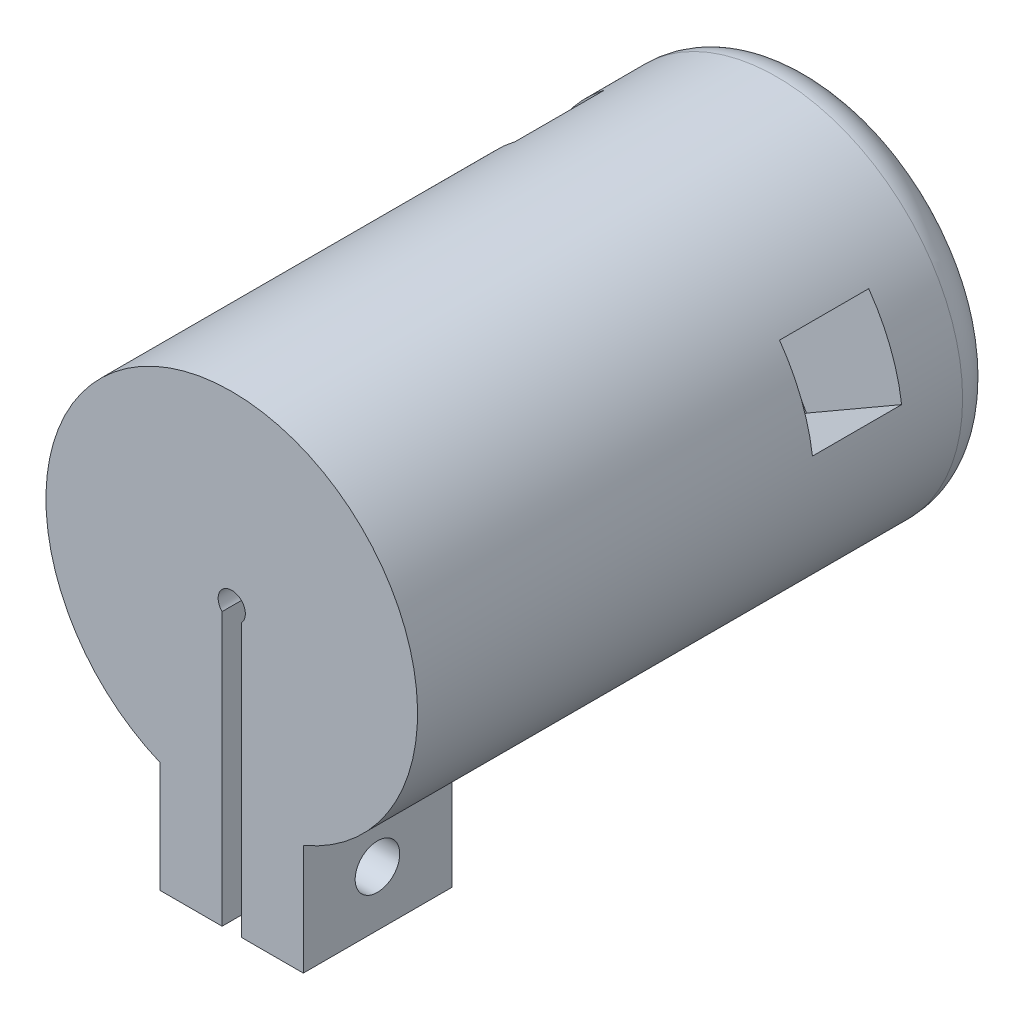
ISO-10303-21;
HEADER;
FILE_DESCRIPTION(('STEP AP214'),'2;1');
FILE_NAME('part.step','',(''),(''),'','','');
FILE_SCHEMA(('AUTOMOTIVE_DESIGN { 1 0 10303 214 1 1 1 1 }'));
ENDSEC;
DATA;
#1=APPLICATION_CONTEXT('core data for automotive mechanical design processes');
#2=APPLICATION_PROTOCOL_DEFINITION('international standard','automotive_design',2000,#1);
#3=PRODUCT_CONTEXT('',#1,'mechanical');
#4=PRODUCT('Part','Part','',(#3));
#5=PRODUCT_RELATED_PRODUCT_CATEGORY('part','',(#4));
#6=PRODUCT_DEFINITION_FORMATION('','',#4);
#7=PRODUCT_DEFINITION_CONTEXT('part definition',#1,'design');
#8=PRODUCT_DEFINITION('design','',#6,#7);
#9=PRODUCT_DEFINITION_SHAPE('','',#8);
#10=(LENGTH_UNIT() NAMED_UNIT(*) SI_UNIT(.MILLI.,.METRE.));
#11=(NAMED_UNIT(*) PLANE_ANGLE_UNIT() SI_UNIT($,.RADIAN.));
#12=(NAMED_UNIT(*) SI_UNIT($,.STERADIAN.) SOLID_ANGLE_UNIT());
#13=UNCERTAINTY_MEASURE_WITH_UNIT(LENGTH_MEASURE(1.E-05),#10,'distance_accuracy_value','');
#14=(GEOMETRIC_REPRESENTATION_CONTEXT(3) GLOBAL_UNCERTAINTY_ASSIGNED_CONTEXT((#13)) GLOBAL_UNIT_ASSIGNED_CONTEXT((#10,
#11,#12)) REPRESENTATION_CONTEXT('',''));
#15=CARTESIAN_POINT('',(0.,0.,0.));
#16=DIRECTION('',(0.,0.,1.));
#17=DIRECTION('',(1.,0.,0.));
#18=AXIS2_PLACEMENT_3D('',#15,#16,#17);
#19=CARTESIAN_POINT('',(0.,0.,-32.));
#20=DIRECTION('',(0.,0.,1.));
#21=DIRECTION('',(1.,0.,0.));
#22=AXIS2_PLACEMENT_3D('',#19,#20,#21);
#23=TOROIDAL_SURFACE('',#22,12.,3.);
#24=CARTESIAN_POINT('',(0.,0.,-35.));
#25=DIRECTION('',(0.,0.,1.));
#26=DIRECTION('',(1.,0.,0.));
#27=AXIS2_PLACEMENT_3D('',#24,#25,#26);
#28=CIRCLE('',#27,12.);
#29=CARTESIAN_POINT('',(12.,0.,-35.));
#30=VERTEX_POINT('',#29);
#31=EDGE_CURVE('E45',#30,#30,#28,.F.);
#32=ORIENTED_EDGE('',*,*,#31,.F.);
#33=EDGE_LOOP('',(#32));
#34=FACE_BOUND('',#33,.T.);
#35=CARTESIAN_POINT('',(0.,0.,-32.));
#36=DIRECTION('',(0.,0.,1.));
#37=DIRECTION('',(1.,0.,0.));
#38=AXIS2_PLACEMENT_3D('',#35,#36,#37);
#39=CIRCLE('',#38,15.);
#40=CARTESIAN_POINT('',(15.,0.,-32.));
#41=VERTEX_POINT('',#40);
#42=EDGE_CURVE('E11',#41,#41,#39,.T.);
#43=ORIENTED_EDGE('',*,*,#42,.F.);
#44=EDGE_LOOP('',(#43));
#45=FACE_BOUND('',#44,.T.);
#46=ADVANCED_FACE('F37',(#34,#45),#23,.T.);
#47=CARTESIAN_POINT('',(0.,0.,12.));
#48=DIRECTION('',(0.,0.,-1.));
#49=DIRECTION('',(-1.,0.,0.));
#50=AXIS2_PLACEMENT_3D('',#47,#48,#49);
#51=CYLINDRICAL_SURFACE('',#50,15.);
#52=ORIENTED_EDGE('',*,*,#42,.T.);
#53=EDGE_LOOP('',(#52));
#54=FACE_BOUND('',#53,.T.);
#55=CARTESIAN_POINT('',(0.,0.,-27.2));
#56=DIRECTION('',(0.,0.,1.));
#57=DIRECTION('',(1.,0.,0.));
#58=AXIS2_PLACEMENT_3D('',#55,#56,#57);
#59=CIRCLE('',#58,15.);
#60=CARTESIAN_POINT('',(14.8769285434171,1.91754976833983,-27.2));
#61=VERTEX_POINT('',#60);
#62=CARTESIAN_POINT('',(12.2207704523787,8.69786005579919,-27.2));
#63=VERTEX_POINT('',#62);
#64=EDGE_CURVE('E339',#61,#63,#59,.T.);
#65=ORIENTED_EDGE('',*,*,#64,.F.);
#66=DIRECTION('',(0.,0.,-1.));
#67=VECTOR('',#66,1.);
#68=CARTESIAN_POINT('',(14.8769285434171,1.91754976833982,12.));
#69=LINE('',#68,#67);
#70=CARTESIAN_POINT('',(14.8769285434171,1.91754976833982,-20.));
#71=VERTEX_POINT('',#70);
#72=EDGE_CURVE('E331',#61,#71,#69,.F.);
#73=ORIENTED_EDGE('',*,*,#72,.T.);
#74=CARTESIAN_POINT('',(0.,0.,-20.));
#75=DIRECTION('',(0.,0.,1.));
#76=DIRECTION('',(0.,-1.,0.));
#77=AXIS2_PLACEMENT_3D('',#74,#75,#76);
#78=CIRCLE('',#77,15.);
#79=CARTESIAN_POINT('',(12.2207704523787,8.69786005579919,-20.));
#80=VERTEX_POINT('',#79);
#81=EDGE_CURVE('E334',#71,#80,#78,.T.);
#82=ORIENTED_EDGE('',*,*,#81,.T.);
#83=DIRECTION('',(0.,0.,-1.));
#84=VECTOR('',#83,1.);
#85=CARTESIAN_POINT('',(12.2207704523787,8.69786005579919,12.));
#86=LINE('',#85,#84);
#87=EDGE_CURVE('E337',#63,#80,#86,.F.);
#88=ORIENTED_EDGE('',*,*,#87,.F.);
#89=EDGE_LOOP('',(#65,#73,#82,#88));
#90=FACE_BOUND('',#89,.T.);
#91=DIRECTION('',(0.,0.,-1.));
#92=VECTOR('',#91,1.);
#93=CARTESIAN_POINT('',(5.7778174593052,-13.842572933055,12.));
#94=LINE('',#93,#92);
#95=CARTESIAN_POINT('',(5.7778174593052,-13.842572933055,12.));
#96=VERTEX_POINT('',#95);
#97=CARTESIAN_POINT('',(5.7778174593052,-13.842572933055,0.));
#98=VERTEX_POINT('',#97);
#99=EDGE_CURVE('E309',#96,#98,#94,.T.);
#100=ORIENTED_EDGE('',*,*,#99,.T.);
#101=CARTESIAN_POINT('',(0.,0.,0.));
#102=DIRECTION('',(0.,0.,1.));
#103=DIRECTION('',(1.,0.,0.));
#104=AXIS2_PLACEMENT_3D('',#101,#102,#103);
#105=CIRCLE('',#104,15.);
#106=CARTESIAN_POINT('',(0.7778174593052,-14.9798197585952,0.));
#107=VERTEX_POINT('',#106);
#108=EDGE_CURVE('E258',#107,#98,#105,.T.);
#109=ORIENTED_EDGE('',*,*,#108,.F.);
#110=CARTESIAN_POINT('',(-0.777817459305205,-14.9798197585952,0.));
#111=VERTEX_POINT('',#110);
#112=EDGE_CURVE('E253',#111,#107,#105,.T.);
#113=ORIENTED_EDGE('',*,*,#112,.F.);
#114=CARTESIAN_POINT('',(-5.7778174593052,-13.842572933055,0.));
#115=VERTEX_POINT('',#114);
#116=EDGE_CURVE('E254',#115,#111,#105,.T.);
#117=ORIENTED_EDGE('',*,*,#116,.F.);
#118=DIRECTION('',(0.,0.,-1.));
#119=VECTOR('',#118,1.);
#120=CARTESIAN_POINT('',(-5.7778174593052,-13.842572933055,12.));
#121=LINE('',#120,#119);
#122=CARTESIAN_POINT('',(-5.7778174593052,-13.842572933055,12.));
#123=VERTEX_POINT('',#122);
#124=EDGE_CURVE('E306',#123,#115,#121,.T.);
#125=ORIENTED_EDGE('',*,*,#124,.F.);
#126=CARTESIAN_POINT('',(0.,0.,12.));
#127=DIRECTION('',(0.,0.,1.));
#128=DIRECTION('',(1.,0.,0.));
#129=AXIS2_PLACEMENT_3D('',#126,#127,#128);
#130=CIRCLE('',#129,15.);
#131=EDGE_CURVE('E269',#96,#123,#130,.T.);
#132=ORIENTED_EDGE('',*,*,#131,.F.);
#133=EDGE_LOOP('',(#100,#109,#113,#117,#125,#132));
#134=FACE_BOUND('',#133,.T.);
#135=CARTESIAN_POINT('',(0.,0.,-27.2));
#136=DIRECTION('',(0.,0.,1.));
#137=DIRECTION('',(1.,0.,0.));
#138=AXIS2_PLACEMENT_3D('',#135,#136,#137);
#139=CIRCLE('',#138,15.);
#140=CARTESIAN_POINT('',(-5.77781745930519,-13.842572933055,-27.2));
#141=VERTEX_POINT('',#140);
#142=CARTESIAN_POINT('',(1.42218254069481,-14.9324276934778,-27.2));
#143=VERTEX_POINT('',#142);
#144=EDGE_CURVE('E329',#141,#143,#139,.T.);
#145=ORIENTED_EDGE('',*,*,#144,.F.);
#146=DIRECTION('',(0.,0.,-1.));
#147=VECTOR('',#146,1.);
#148=CARTESIAN_POINT('',(-5.77781745930519,-13.842572933055,12.));
#149=LINE('',#148,#147);
#150=CARTESIAN_POINT('',(-5.77781745930519,-13.842572933055,-20.));
#151=VERTEX_POINT('',#150);
#152=EDGE_CURVE('E321',#141,#151,#149,.F.);
#153=ORIENTED_EDGE('',*,*,#152,.T.);
#154=CARTESIAN_POINT('',(0.,0.,-20.));
#155=DIRECTION('',(0.,0.,1.));
#156=DIRECTION('',(1.,0.,0.));
#157=AXIS2_PLACEMENT_3D('',#154,#155,#156);
#158=CIRCLE('',#157,15.);
#159=CARTESIAN_POINT('',(1.42218254069481,-14.9324276934778,-20.));
#160=VERTEX_POINT('',#159);
#161=EDGE_CURVE('E324',#151,#160,#158,.T.);
#162=ORIENTED_EDGE('',*,*,#161,.T.);
#163=DIRECTION('',(0.,0.,-1.));
#164=VECTOR('',#163,1.);
#165=CARTESIAN_POINT('',(1.42218254069481,-14.9324276934778,12.));
#166=LINE('',#165,#164);
#167=EDGE_CURVE('E327',#143,#160,#166,.F.);
#168=ORIENTED_EDGE('',*,*,#167,.F.);
#169=EDGE_LOOP('',(#145,#153,#162,#168));
#170=FACE_BOUND('',#169,.T.);
#171=CARTESIAN_POINT('',(0.,0.,-27.2));
#172=DIRECTION('',(0.,0.,1.));
#173=DIRECTION('',(1.,0.,0.));
#174=AXIS2_PLACEMENT_3D('',#171,#172,#173);
#175=CIRCLE('',#174,15.);
#176=CARTESIAN_POINT('',(-9.09911108411189,11.9250231647151,-27.2));
#177=VERTEX_POINT('',#176);
#178=CARTESIAN_POINT('',(-13.6429529930734,6.23456763767856,-27.2));
#179=VERTEX_POINT('',#178);
#180=EDGE_CURVE('E187',#177,#179,#175,.T.);
#181=ORIENTED_EDGE('',*,*,#180,.F.);
#182=DIRECTION('',(0.,0.,-1.));
#183=VECTOR('',#182,1.);
#184=CARTESIAN_POINT('',(-9.09911108411188,11.9250231647151,12.));
#185=LINE('',#184,#183);
#186=CARTESIAN_POINT('',(-9.09911108411188,11.9250231647151,-20.));
#187=VERTEX_POINT('',#186);
#188=EDGE_CURVE('E341',#177,#187,#185,.F.);
#189=ORIENTED_EDGE('',*,*,#188,.T.);
#190=CARTESIAN_POINT('',(0.,0.,-20.));
#191=DIRECTION('',(0.,0.,1.));
#192=DIRECTION('',(0.,-1.,0.));
#193=AXIS2_PLACEMENT_3D('',#190,#191,#192);
#194=CIRCLE('',#193,15.);
#195=CARTESIAN_POINT('',(-13.6429529930734,6.23456763767856,-20.));
#196=VERTEX_POINT('',#195);
#197=EDGE_CURVE('E344',#187,#196,#194,.T.);
#198=ORIENTED_EDGE('',*,*,#197,.T.);
#199=DIRECTION('',(0.,0.,-1.));
#200=VECTOR('',#199,1.);
#201=CARTESIAN_POINT('',(-13.6429529930734,6.23456763767857,12.));
#202=LINE('',#201,#200);
#203=EDGE_CURVE('E347',#179,#196,#202,.F.);
#204=ORIENTED_EDGE('',*,*,#203,.F.);
#205=EDGE_LOOP('',(#181,#189,#198,#204));
#206=FACE_BOUND('',#205,.T.);
#207=ADVANCED_FACE('F357',(#54,#90,#134,#170,#206),#51,.T.);
#208=CARTESIAN_POINT('',(0.,0.,0.));
#209=DIRECTION('',(0.,0.,1.));
#210=DIRECTION('',(1.,0.,0.));
#211=AXIS2_PLACEMENT_3D('',#208,#209,#210);
#212=PLANE('',#211);
#213=DIRECTION('',(0.,1.,0.));
#214=VECTOR('',#213,1.);
#215=CARTESIAN_POINT('',(-5.7778174593052,0.,0.));
#216=LINE('',#215,#214);
#217=CARTESIAN_POINT('',(-5.7778174593052,-22.7778174593052,0.));
#218=VERTEX_POINT('',#217);
#219=EDGE_CURVE('E291',#218,#115,#216,.T.);
#220=ORIENTED_EDGE('',*,*,#219,.T.);
#221=ORIENTED_EDGE('',*,*,#116,.T.);
#222=DIRECTION('',(0.,-1.,0.));
#223=VECTOR('',#222,1.);
#224=CARTESIAN_POINT('',(-0.777817459305206,0.,0.));
#225=LINE('',#224,#223);
#226=CARTESIAN_POINT('',(-0.777817459305204,-22.7778174593052,0.));
#227=VERTEX_POINT('',#226);
#228=EDGE_CURVE('E297',#111,#227,#225,.T.);
#229=ORIENTED_EDGE('',*,*,#228,.T.);
#230=DIRECTION('',(-1.,0.,0.));
#231=VECTOR('',#230,1.);
#232=CARTESIAN_POINT('',(0.,-22.7778174593052,0.));
#233=LINE('',#232,#231);
#234=EDGE_CURVE('E294',#227,#218,#233,.T.);
#235=ORIENTED_EDGE('',*,*,#234,.T.);
#236=EDGE_LOOP('',(#220,#221,#229,#235));
#237=FACE_BOUND('',#236,.T.);
#238=ADVANCED_FACE('F362',(#237),#212,.F.);
#239=CARTESIAN_POINT('',(0.,0.,12.));
#240=DIRECTION('',(0.,0.,-1.));
#241=DIRECTION('',(-1.,0.,0.));
#242=AXIS2_PLACEMENT_3D('',#239,#240,#241);
#243=CYLINDRICAL_SURFACE('',#242,1.1);
#244=CARTESIAN_POINT('',(0.,0.,0.));
#245=DIRECTION('',(0.,0.,1.));
#246=DIRECTION('',(1.,0.,0.));
#247=AXIS2_PLACEMENT_3D('',#244,#245,#246);
#248=CIRCLE('',#247,1.1);
#249=CARTESIAN_POINT('',(0.777817459305198,-0.777817459305206,0.));
#250=VERTEX_POINT('',#249);
#251=CARTESIAN_POINT('',(-0.777817459305206,-0.777817459305198,0.));
#252=VERTEX_POINT('',#251);
#253=EDGE_CURVE('E257',#250,#252,#248,.T.);
#254=ORIENTED_EDGE('',*,*,#253,.F.);
#255=DIRECTION('',(0.,0.,-1.));
#256=VECTOR('',#255,1.);
#257=CARTESIAN_POINT('',(0.777817459305198,-0.777817459305206,12.));
#258=LINE('',#257,#256);
#259=CARTESIAN_POINT('',(0.777817459305198,-0.777817459305206,12.));
#260=VERTEX_POINT('',#259);
#261=EDGE_CURVE('E318',#260,#250,#258,.T.);
#262=ORIENTED_EDGE('',*,*,#261,.F.);
#263=CARTESIAN_POINT('',(0.,0.,12.));
#264=DIRECTION('',(0.,0.,1.));
#265=DIRECTION('',(1.,0.,0.));
#266=AXIS2_PLACEMENT_3D('',#263,#264,#265);
#267=CIRCLE('',#266,1.1);
#268=CARTESIAN_POINT('',(-0.777817459305206,-0.777817459305198,12.));
#269=VERTEX_POINT('',#268);
#270=EDGE_CURVE('E259',#260,#269,#267,.T.);
#271=ORIENTED_EDGE('',*,*,#270,.T.);
#272=DIRECTION('',(0.,0.,-1.));
#273=VECTOR('',#272,1.);
#274=CARTESIAN_POINT('',(-0.777817459305206,-0.777817459305198,12.));
#275=LINE('',#274,#273);
#276=EDGE_CURVE('E280',#269,#252,#275,.T.);
#277=ORIENTED_EDGE('',*,*,#276,.T.);
#278=EDGE_LOOP('',(#254,#262,#271,#277));
#279=FACE_BOUND('',#278,.T.);
#280=ADVANCED_FACE('F466',(#279),#243,.F.);
#281=CARTESIAN_POINT('',(0.777817459305198,0.,12.));
#282=DIRECTION('',(1.,0.,0.));
#283=DIRECTION('',(0.,1.,0.));
#284=AXIS2_PLACEMENT_3D('',#281,#282,#283);
#285=PLANE('',#284);
#286=CARTESIAN_POINT('',(0.777817459305201,-18.3217496466459,6.01614639735323));
#287=DIRECTION('',(1.,0.,0.));
#288=DIRECTION('',(0.,1.,0.));
#289=AXIS2_PLACEMENT_3D('',#286,#287,#288);
#290=CIRCLE('',#289,1.8);
#291=CARTESIAN_POINT('',(0.777817459305201,-16.5217496466459,6.01614639735323));
#292=VERTEX_POINT('',#291);
#293=EDGE_CURVE('E704',#292,#292,#290,.T.);
#294=ORIENTED_EDGE('',*,*,#293,.T.);
#295=EDGE_LOOP('',(#294));
#296=FACE_BOUND('',#295,.T.);
#297=DIRECTION('',(0.,-1.,0.));
#298=VECTOR('',#297,1.);
#299=CARTESIAN_POINT('',(0.777817459305198,0.,0.));
#300=LINE('',#299,#298);
#301=EDGE_CURVE('E283',#250,#107,#300,.T.);
#302=ORIENTED_EDGE('',*,*,#301,.T.);
#303=CARTESIAN_POINT('',(0.777817459305201,-22.7778174593052,0.));
#304=VERTEX_POINT('',#303);
#305=EDGE_CURVE('E282',#107,#304,#300,.T.);
#306=ORIENTED_EDGE('',*,*,#305,.T.);
#307=DIRECTION('',(0.,0.,-1.));
#308=VECTOR('',#307,1.);
#309=CARTESIAN_POINT('',(0.777817459305201,-22.7778174593052,12.));
#310=LINE('',#309,#308);
#311=CARTESIAN_POINT('',(0.777817459305201,-22.7778174593052,12.));
#312=VERTEX_POINT('',#311);
#313=EDGE_CURVE('E315',#312,#304,#310,.T.);
#314=ORIENTED_EDGE('',*,*,#313,.F.);
#315=DIRECTION('',(0.,-1.,0.));
#316=VECTOR('',#315,1.);
#317=CARTESIAN_POINT('',(0.777817459305198,0.,12.));
#318=LINE('',#317,#316);
#319=EDGE_CURVE('E262',#260,#312,#318,.T.);
#320=ORIENTED_EDGE('',*,*,#319,.F.);
#321=ORIENTED_EDGE('',*,*,#261,.T.);
#322=EDGE_LOOP('',(#302,#306,#314,#320,#321));
#323=FACE_BOUND('',#322,.T.);
#324=ADVANCED_FACE('F463',(#296,#323),#285,.F.);
#325=CARTESIAN_POINT('',(0.,-22.7778174593052,12.));
#326=DIRECTION('',(0.,1.,0.));
#327=DIRECTION('',(0.,0.,1.));
#328=AXIS2_PLACEMENT_3D('',#325,#326,#327);
#329=PLANE('',#328);
#330=DIRECTION('',(1.,0.,0.));
#331=VECTOR('',#330,1.);
#332=CARTESIAN_POINT('',(0.,-22.7778174593052,0.));
#333=LINE('',#332,#331);
#334=CARTESIAN_POINT('',(5.7778174593052,-22.7778174593052,0.));
#335=VERTEX_POINT('',#334);
#336=EDGE_CURVE('E286',#304,#335,#333,.T.);
#337=ORIENTED_EDGE('',*,*,#336,.T.);
#338=DIRECTION('',(0.,0.,-1.));
#339=VECTOR('',#338,1.);
#340=CARTESIAN_POINT('',(5.7778174593052,-22.7778174593052,12.));
#341=LINE('',#340,#339);
#342=CARTESIAN_POINT('',(5.7778174593052,-22.7778174593052,12.));
#343=VERTEX_POINT('',#342);
#344=EDGE_CURVE('E312',#343,#335,#341,.T.);
#345=ORIENTED_EDGE('',*,*,#344,.F.);
#346=DIRECTION('',(1.,0.,0.));
#347=VECTOR('',#346,1.);
#348=CARTESIAN_POINT('',(0.,-22.7778174593052,12.));
#349=LINE('',#348,#347);
#350=EDGE_CURVE('E265',#312,#343,#349,.T.);
#351=ORIENTED_EDGE('',*,*,#350,.F.);
#352=ORIENTED_EDGE('',*,*,#313,.T.);
#353=EDGE_LOOP('',(#337,#345,#351,#352));
#354=FACE_BOUND('',#353,.T.);
#355=ADVANCED_FACE('F459',(#354),#329,.F.);
#356=CARTESIAN_POINT('',(5.77781745930521,0.,12.));
#357=DIRECTION('',(-1.,0.,0.));
#358=DIRECTION('',(0.,-1.,0.));
#359=AXIS2_PLACEMENT_3D('',#356,#357,#358);
#360=PLANE('',#359);
#361=CARTESIAN_POINT('',(5.7778174593052,-18.3217496466459,6.01614639735323));
#362=DIRECTION('',(-1.,0.,0.));
#363=DIRECTION('',(0.,-1.,0.));
#364=AXIS2_PLACEMENT_3D('',#361,#362,#363);
#365=CIRCLE('',#364,1.8);
#366=CARTESIAN_POINT('',(5.7778174593052,-20.1217496466459,6.01614639735323));
#367=VERTEX_POINT('',#366);
#368=EDGE_CURVE('E210',#367,#367,#365,.T.);
#369=ORIENTED_EDGE('',*,*,#368,.T.);
#370=EDGE_LOOP('',(#369));
#371=FACE_BOUND('',#370,.T.);
#372=DIRECTION('',(0.,1.,0.));
#373=VECTOR('',#372,1.);
#374=CARTESIAN_POINT('',(5.77781745930521,0.,0.));
#375=LINE('',#374,#373);
#376=EDGE_CURVE('E288',#335,#98,#375,.T.);
#377=ORIENTED_EDGE('',*,*,#376,.T.);
#378=ORIENTED_EDGE('',*,*,#99,.F.);
#379=DIRECTION('',(0.,1.,0.));
#380=VECTOR('',#379,1.);
#381=CARTESIAN_POINT('',(5.77781745930521,0.,12.));
#382=LINE('',#381,#380);
#383=EDGE_CURVE('E267',#343,#96,#382,.T.);
#384=ORIENTED_EDGE('',*,*,#383,.F.);
#385=ORIENTED_EDGE('',*,*,#344,.T.);
#386=EDGE_LOOP('',(#377,#378,#384,#385));
#387=FACE_BOUND('',#386,.T.);
#388=ADVANCED_FACE('F454',(#371,#387),#360,.F.);
#389=CARTESIAN_POINT('',(-5.7778174593052,0.,12.));
#390=DIRECTION('',(-1.,0.,0.));
#391=DIRECTION('',(0.,-1.,0.));
#392=AXIS2_PLACEMENT_3D('',#389,#390,#391);
#393=PLANE('',#392);
#394=CARTESIAN_POINT('',(-5.7778174593052,-18.3217496466459,6.01614639735323));
#395=DIRECTION('',(-1.,0.,0.));
#396=DIRECTION('',(0.,0.,1.));
#397=AXIS2_PLACEMENT_3D('',#394,#395,#396);
#398=CIRCLE('',#397,3.15);
#399=CARTESIAN_POINT('',(-5.7778174593052,-18.3217496466459,9.16614639735323));
#400=VERTEX_POINT('',#399);
#401=EDGE_CURVE('E712',#400,#400,#398,.T.);
#402=ORIENTED_EDGE('',*,*,#401,.F.);
#403=EDGE_LOOP('',(#402));
#404=FACE_BOUND('',#403,.T.);
#405=ORIENTED_EDGE('',*,*,#219,.F.);
#406=DIRECTION('',(0.,0.,-1.));
#407=VECTOR('',#406,1.);
#408=CARTESIAN_POINT('',(-5.7778174593052,-22.7778174593052,12.));
#409=LINE('',#408,#407);
#410=CARTESIAN_POINT('',(-5.7778174593052,-22.7778174593052,12.));
#411=VERTEX_POINT('',#410);
#412=EDGE_CURVE('E304',#411,#218,#409,.T.);
#413=ORIENTED_EDGE('',*,*,#412,.F.);
#414=DIRECTION('',(0.,1.,0.));
#415=VECTOR('',#414,1.);
#416=CARTESIAN_POINT('',(-5.7778174593052,0.,12.));
#417=LINE('',#416,#415);
#418=EDGE_CURVE('E271',#411,#123,#417,.T.);
#419=ORIENTED_EDGE('',*,*,#418,.T.);
#420=ORIENTED_EDGE('',*,*,#124,.T.);
#421=EDGE_LOOP('',(#405,#413,#419,#420));
#422=FACE_BOUND('',#421,.T.);
#423=ADVANCED_FACE('F451',(#404,#422),#393,.T.);
#424=CARTESIAN_POINT('',(0.,-22.7778174593052,12.));
#425=DIRECTION('',(0.,-1.,0.));
#426=DIRECTION('',(0.,0.,-1.));
#427=AXIS2_PLACEMENT_3D('',#424,#425,#426);
#428=PLANE('',#427);
#429=ORIENTED_EDGE('',*,*,#234,.F.);
#430=DIRECTION('',(0.,0.,-1.));
#431=VECTOR('',#430,1.);
#432=CARTESIAN_POINT('',(-0.777817459305204,-22.7778174593052,12.));
#433=LINE('',#432,#431);
#434=CARTESIAN_POINT('',(-0.777817459305204,-22.7778174593052,12.));
#435=VERTEX_POINT('',#434);
#436=EDGE_CURVE('E301',#435,#227,#433,.T.);
#437=ORIENTED_EDGE('',*,*,#436,.F.);
#438=DIRECTION('',(-1.,0.,0.));
#439=VECTOR('',#438,1.);
#440=CARTESIAN_POINT('',(0.,-22.7778174593052,12.));
#441=LINE('',#440,#439);
#442=EDGE_CURVE('E274',#435,#411,#441,.T.);
#443=ORIENTED_EDGE('',*,*,#442,.T.);
#444=ORIENTED_EDGE('',*,*,#412,.T.);
#445=EDGE_LOOP('',(#429,#437,#443,#444));
#446=FACE_BOUND('',#445,.T.);
#447=ADVANCED_FACE('F447',(#446),#428,.T.);
#448=CARTESIAN_POINT('',(-0.777817459305206,0.,12.));
#449=DIRECTION('',(1.,0.,0.));
#450=DIRECTION('',(0.,1.,0.));
#451=AXIS2_PLACEMENT_3D('',#448,#449,#450);
#452=PLANE('',#451);
#453=CARTESIAN_POINT('',(-0.777817459305205,-18.3217496466459,6.01614639735323));
#454=DIRECTION('',(1.,0.,0.));
#455=DIRECTION('',(0.,1.,0.));
#456=AXIS2_PLACEMENT_3D('',#453,#454,#455);
#457=CIRCLE('',#456,1.8);
#458=CARTESIAN_POINT('',(-0.777817459305205,-16.5217496466459,6.01614639735323));
#459=VERTEX_POINT('',#458);
#460=EDGE_CURVE('E40',#459,#459,#457,.T.);
#461=ORIENTED_EDGE('',*,*,#460,.F.);
#462=EDGE_LOOP('',(#461));
#463=FACE_BOUND('',#462,.T.);
#464=EDGE_CURVE('E263',#252,#111,#225,.T.);
#465=ORIENTED_EDGE('',*,*,#464,.F.);
#466=ORIENTED_EDGE('',*,*,#276,.F.);
#467=DIRECTION('',(0.,-1.,0.));
#468=VECTOR('',#467,1.);
#469=CARTESIAN_POINT('',(-0.777817459305206,0.,12.));
#470=LINE('',#469,#468);
#471=EDGE_CURVE('E277',#269,#435,#470,.T.);
#472=ORIENTED_EDGE('',*,*,#471,.T.);
#473=ORIENTED_EDGE('',*,*,#436,.T.);
#474=ORIENTED_EDGE('',*,*,#228,.F.);
#475=EDGE_LOOP('',(#465,#466,#472,#473,#474));
#476=FACE_BOUND('',#475,.T.);
#477=ADVANCED_FACE('F440',(#463,#476),#452,.T.);
#478=CARTESIAN_POINT('',(0.,0.,12.));
#479=DIRECTION('',(0.,0.,1.));
#480=DIRECTION('',(1.,0.,0.));
#481=AXIS2_PLACEMENT_3D('',#478,#479,#480);
#482=PLANE('',#481);
#483=ORIENTED_EDGE('',*,*,#270,.F.);
#484=ORIENTED_EDGE('',*,*,#319,.T.);
#485=ORIENTED_EDGE('',*,*,#350,.T.);
#486=ORIENTED_EDGE('',*,*,#383,.T.);
#487=ORIENTED_EDGE('',*,*,#131,.T.);
#488=ORIENTED_EDGE('',*,*,#418,.F.);
#489=ORIENTED_EDGE('',*,*,#442,.F.);
#490=ORIENTED_EDGE('',*,*,#471,.F.);
#491=EDGE_LOOP('',(#483,#484,#485,#486,#487,#488,#489,#490));
#492=FACE_BOUND('',#491,.T.);
#493=ADVANCED_FACE('F437',(#492),#482,.T.);
#494=ORIENTED_EDGE('',*,*,#305,.F.);
#495=ORIENTED_EDGE('',*,*,#108,.T.);
#496=ORIENTED_EDGE('',*,*,#376,.F.);
#497=ORIENTED_EDGE('',*,*,#336,.F.);
#498=EDGE_LOOP('',(#494,#495,#496,#497));
#499=FACE_BOUND('',#498,.T.);
#500=ADVANCED_FACE('F433',(#499),#212,.F.);
#501=CARTESIAN_POINT('',(0.,0.,-35.));
#502=DIRECTION('',(0.,0.,1.));
#503=DIRECTION('',(1.,0.,0.));
#504=AXIS2_PLACEMENT_3D('',#501,#502,#503);
#505=PLANE('',#504);
#506=ORIENTED_EDGE('',*,*,#31,.T.);
#507=EDGE_LOOP('',(#506));
#508=FACE_BOUND('',#507,.T.);
#509=ADVANCED_FACE('F353',(#508),#505,.F.);
#510=CARTESIAN_POINT('',(0.,0.,0.));
#511=DIRECTION('',(0.,0.,1.));
#512=DIRECTION('',(1.,0.,0.));
#513=AXIS2_PLACEMENT_3D('',#510,#511,#512);
#514=PLANE('',#513);
#515=ORIENTED_EDGE('',*,*,#253,.T.);
#516=ORIENTED_EDGE('',*,*,#464,.T.);
#517=ORIENTED_EDGE('',*,*,#112,.T.);
#518=ORIENTED_EDGE('',*,*,#301,.F.);
#519=EDGE_LOOP('',(#515,#516,#517,#518));
#520=FACE_BOUND('',#519,.T.);
#521=ADVANCED_FACE('F429',(#520),#514,.T.);
#522=CARTESIAN_POINT('',(0.,-24.9798197585952,-27.2));
#523=DIRECTION('',(0.,0.,1.));
#524=DIRECTION('',(1.,0.,0.));
#525=AXIS2_PLACEMENT_3D('',#522,#523,#524);
#526=PLANE('',#525);
#527=ORIENTED_EDGE('',*,*,#144,.T.);
#528=DIRECTION('',(0.,1.,0.));
#529=VECTOR('',#528,1.);
#530=CARTESIAN_POINT('',(1.4221825406948,-24.9798197585952,-27.2));
#531=LINE('',#530,#529);
#532=CARTESIAN_POINT('',(1.42218254069482,-4.97981975859523,-27.2));
#533=VERTEX_POINT('',#532);
#534=EDGE_CURVE('E251',#143,#533,#531,.T.);
#535=ORIENTED_EDGE('',*,*,#534,.T.);
#536=DIRECTION('',(1.,0.,0.));
#537=VECTOR('',#536,1.);
#538=CARTESIAN_POINT('',(0.,-4.97981975859523,-27.2));
#539=LINE('',#538,#537);
#540=CARTESIAN_POINT('',(-5.77781745930518,-4.97981975859522,-27.2));
#541=VERTEX_POINT('',#540);
#542=EDGE_CURVE('E190',#541,#533,#539,.T.);
#543=ORIENTED_EDGE('',*,*,#542,.F.);
#544=DIRECTION('',(0.,1.,0.));
#545=VECTOR('',#544,1.);
#546=CARTESIAN_POINT('',(-5.7778174593052,-24.9798197585952,-27.2));
#547=LINE('',#546,#545);
#548=EDGE_CURVE('E245',#141,#541,#547,.T.);
#549=ORIENTED_EDGE('',*,*,#548,.F.);
#550=EDGE_LOOP('',(#527,#535,#543,#549));
#551=FACE_BOUND('',#550,.T.);
#552=ADVANCED_FACE('F425',(#551),#526,.T.);
#553=CARTESIAN_POINT('',(1.4221825406948,-24.9798197585952,0.));
#554=DIRECTION('',(-1.,0.,0.));
#555=DIRECTION('',(0.,-1.,0.));
#556=AXIS2_PLACEMENT_3D('',#553,#554,#555);
#557=PLANE('',#556);
#558=ORIENTED_EDGE('',*,*,#167,.T.);
#559=DIRECTION('',(0.,1.,0.));
#560=VECTOR('',#559,1.);
#561=CARTESIAN_POINT('',(1.4221825406948,-24.9798197585952,-20.));
#562=LINE('',#561,#560);
#563=CARTESIAN_POINT('',(1.42218254069482,-4.97981975859523,-20.));
#564=VERTEX_POINT('',#563);
#565=EDGE_CURVE('E249',#160,#564,#562,.T.);
#566=ORIENTED_EDGE('',*,*,#565,.T.);
#567=DIRECTION('',(0.,0.,1.));
#568=VECTOR('',#567,1.);
#569=CARTESIAN_POINT('',(1.42218254069481,-4.97981975859523,0.));
#570=LINE('',#569,#568);
#571=EDGE_CURVE('E236',#533,#564,#570,.T.);
#572=ORIENTED_EDGE('',*,*,#571,.F.);
#573=ORIENTED_EDGE('',*,*,#534,.F.);
#574=EDGE_LOOP('',(#558,#566,#572,#573));
#575=FACE_BOUND('',#574,.T.);
#576=ADVANCED_FACE('F421',(#575),#557,.T.);
#577=CARTESIAN_POINT('',(0.,-24.9798197585952,-20.));
#578=DIRECTION('',(0.,0.,1.));
#579=DIRECTION('',(1.,0.,0.));
#580=AXIS2_PLACEMENT_3D('',#577,#578,#579);
#581=PLANE('',#580);
#582=DIRECTION('',(0.,1.,0.));
#583=VECTOR('',#582,1.);
#584=CARTESIAN_POINT('',(-5.7778174593052,-24.9798197585952,-20.));
#585=LINE('',#584,#583);
#586=CARTESIAN_POINT('',(-5.77781745930518,-4.97981975859522,-20.));
#587=VERTEX_POINT('',#586);
#588=EDGE_CURVE('E247',#151,#587,#585,.T.);
#589=ORIENTED_EDGE('',*,*,#588,.T.);
#590=DIRECTION('',(1.,0.,0.));
#591=VECTOR('',#590,1.);
#592=CARTESIAN_POINT('',(0.,-4.97981975859523,-20.));
#593=LINE('',#592,#591);
#594=EDGE_CURVE('E239',#587,#564,#593,.T.);
#595=ORIENTED_EDGE('',*,*,#594,.T.);
#596=ORIENTED_EDGE('',*,*,#565,.F.);
#597=ORIENTED_EDGE('',*,*,#161,.F.);
#598=EDGE_LOOP('',(#589,#595,#596,#597));
#599=FACE_BOUND('',#598,.T.);
#600=ADVANCED_FACE('F417',(#599),#581,.F.);
#601=CARTESIAN_POINT('',(-5.7778174593052,-24.9798197585952,0.));
#602=DIRECTION('',(-1.,0.,0.));
#603=DIRECTION('',(0.,-1.,0.));
#604=AXIS2_PLACEMENT_3D('',#601,#602,#603);
#605=PLANE('',#604);
#606=ORIENTED_EDGE('',*,*,#548,.T.);
#607=DIRECTION('',(0.,0.,1.));
#608=VECTOR('',#607,1.);
#609=CARTESIAN_POINT('',(-5.77781745930519,-4.97981975859522,0.));
#610=LINE('',#609,#608);
#611=EDGE_CURVE('E242',#541,#587,#610,.T.);
#612=ORIENTED_EDGE('',*,*,#611,.T.);
#613=ORIENTED_EDGE('',*,*,#588,.F.);
#614=ORIENTED_EDGE('',*,*,#152,.F.);
#615=EDGE_LOOP('',(#606,#612,#613,#614));
#616=FACE_BOUND('',#615,.T.);
#617=ADVANCED_FACE('F413',(#616),#605,.F.);
#618=CARTESIAN_POINT('',(0.,-4.97981975859523,0.));
#619=DIRECTION('',(0.,-1.,0.));
#620=DIRECTION('',(1.,0.,0.));
#621=AXIS2_PLACEMENT_3D('',#618,#619,#620);
#622=PLANE('',#621);
#623=ORIENTED_EDGE('',*,*,#542,.T.);
#624=ORIENTED_EDGE('',*,*,#571,.T.);
#625=ORIENTED_EDGE('',*,*,#594,.F.);
#626=ORIENTED_EDGE('',*,*,#611,.F.);
#627=EDGE_LOOP('',(#623,#624,#625,#626));
#628=FACE_BOUND('',#627,.T.);
#629=ADVANCED_FACE('F409',(#628),#622,.T.);
#630=CARTESIAN_POINT('',(21.6331584929001,12.4899098792974,-27.2));
#631=DIRECTION('',(0.,0.,1.));
#632=DIRECTION('',(1.,0.,0.));
#633=AXIS2_PLACEMENT_3D('',#630,#631,#632);
#634=PLANE('',#633);
#635=ORIENTED_EDGE('',*,*,#64,.T.);
#636=DIRECTION('',(-0.866025403784444,-0.499999999999991,0.));
#637=VECTOR('',#636,1.);
#638=CARTESIAN_POINT('',(20.9220672225527,13.7215560883578,-27.2));
#639=LINE('',#638,#637);
#640=CARTESIAN_POINT('',(3.60155914686378,3.72155608835799,-27.2));
#641=VERTEX_POINT('',#640);
#642=EDGE_CURVE('E205',#63,#641,#639,.T.);
#643=ORIENTED_EDGE('',*,*,#642,.T.);
#644=DIRECTION('',(-0.499999999999991,0.866025403784444,0.));
#645=VECTOR('',#644,1.);
#646=CARTESIAN_POINT('',(4.31265041721118,2.48990987929757,-27.2));
#647=LINE('',#646,#645);
#648=CARTESIAN_POINT('',(7.20155914686372,-2.51382681889001,-27.2));
#649=VERTEX_POINT('',#648);
#650=EDGE_CURVE('E219',#649,#641,#647,.T.);
#651=ORIENTED_EDGE('',*,*,#650,.F.);
#652=DIRECTION('',(-0.866025403784444,-0.499999999999991,0.));
#653=VECTOR('',#652,1.);
#654=CARTESIAN_POINT('',(24.5220672225526,7.48617318110982,-27.2));
#655=LINE('',#654,#653);
#656=EDGE_CURVE('E230',#61,#649,#655,.T.);
#657=ORIENTED_EDGE('',*,*,#656,.F.);
#658=EDGE_LOOP('',(#635,#643,#651,#657));
#659=FACE_BOUND('',#658,.T.);
#660=ADVANCED_FACE('F405',(#659),#634,.T.);
#661=CARTESIAN_POINT('',(20.9220672225527,13.7215560883578,0.));
#662=DIRECTION('',(0.499999999999991,-0.866025403784444,0.));
#663=DIRECTION('',(0.866025403784444,0.499999999999991,0.));
#664=AXIS2_PLACEMENT_3D('',#661,#662,#663);
#665=PLANE('',#664);
#666=ORIENTED_EDGE('',*,*,#87,.T.);
#667=DIRECTION('',(-0.866025403784444,-0.499999999999991,0.));
#668=VECTOR('',#667,1.);
#669=CARTESIAN_POINT('',(20.9220672225527,13.7215560883578,-20.));
#670=LINE('',#669,#668);
#671=CARTESIAN_POINT('',(3.60155914686378,3.72155608835799,-20.));
#672=VERTEX_POINT('',#671);
#673=EDGE_CURVE('E207',#80,#672,#670,.T.);
#674=ORIENTED_EDGE('',*,*,#673,.T.);
#675=DIRECTION('',(0.,0.,1.));
#676=VECTOR('',#675,1.);
#677=CARTESIAN_POINT('',(3.60155914686378,3.72155608835799,0.));
#678=LINE('',#677,#676);
#679=EDGE_CURVE('E222',#641,#672,#678,.T.);
#680=ORIENTED_EDGE('',*,*,#679,.F.);
#681=ORIENTED_EDGE('',*,*,#642,.F.);
#682=EDGE_LOOP('',(#666,#674,#680,#681));
#683=FACE_BOUND('',#682,.T.);
#684=ADVANCED_FACE('F401',(#683),#665,.T.);
#685=CARTESIAN_POINT('',(21.6331584929001,12.4899098792974,-20.));
#686=DIRECTION('',(0.,0.,1.));
#687=DIRECTION('',(0.,-1.,0.));
#688=AXIS2_PLACEMENT_3D('',#685,#686,#687);
#689=PLANE('',#688);
#690=DIRECTION('',(-0.866025403784444,-0.499999999999991,0.));
#691=VECTOR('',#690,1.);
#692=CARTESIAN_POINT('',(24.5220672225526,7.48617318110982,-20.));
#693=LINE('',#692,#691);
#694=CARTESIAN_POINT('',(7.20155914686372,-2.51382681889001,-20.));
#695=VERTEX_POINT('',#694);
#696=EDGE_CURVE('E60',#71,#695,#693,.T.);
#697=ORIENTED_EDGE('',*,*,#696,.T.);
#698=DIRECTION('',(-0.499999999999991,0.866025403784444,0.));
#699=VECTOR('',#698,1.);
#700=CARTESIAN_POINT('',(4.31265041721117,2.48990987929758,-20.));
#701=LINE('',#700,#699);
#702=EDGE_CURVE('E225',#695,#672,#701,.T.);
#703=ORIENTED_EDGE('',*,*,#702,.T.);
#704=ORIENTED_EDGE('',*,*,#673,.F.);
#705=ORIENTED_EDGE('',*,*,#81,.F.);
#706=EDGE_LOOP('',(#697,#703,#704,#705));
#707=FACE_BOUND('',#706,.T.);
#708=ADVANCED_FACE('F398',(#707),#689,.F.);
#709=CARTESIAN_POINT('',(24.5220672225526,7.48617318110982,0.));
#710=DIRECTION('',(0.499999999999991,-0.866025403784444,0.));
#711=DIRECTION('',(0.866025403784444,0.499999999999991,0.));
#712=AXIS2_PLACEMENT_3D('',#709,#710,#711);
#713=PLANE('',#712);
#714=ORIENTED_EDGE('',*,*,#656,.T.);
#715=DIRECTION('',(0.,0.,1.));
#716=VECTOR('',#715,1.);
#717=CARTESIAN_POINT('',(7.20155914686372,-2.51382681889001,0.));
#718=LINE('',#717,#716);
#719=EDGE_CURVE('E228',#649,#695,#718,.T.);
#720=ORIENTED_EDGE('',*,*,#719,.T.);
#721=ORIENTED_EDGE('',*,*,#696,.F.);
#722=ORIENTED_EDGE('',*,*,#72,.F.);
#723=EDGE_LOOP('',(#714,#720,#721,#722));
#724=FACE_BOUND('',#723,.T.);
#725=ADVANCED_FACE('F394',(#724),#713,.F.);
#726=CARTESIAN_POINT('',(4.31265041721118,2.48990987929757,0.));
#727=DIRECTION('',(0.866025403784444,0.499999999999991,0.));
#728=DIRECTION('',(-0.499999999999991,0.866025403784444,0.));
#729=AXIS2_PLACEMENT_3D('',#726,#727,#728);
#730=PLANE('',#729);
#731=ORIENTED_EDGE('',*,*,#650,.T.);
#732=ORIENTED_EDGE('',*,*,#679,.T.);
#733=ORIENTED_EDGE('',*,*,#702,.F.);
#734=ORIENTED_EDGE('',*,*,#719,.F.);
#735=EDGE_LOOP('',(#731,#732,#733,#734));
#736=FACE_BOUND('',#735,.T.);
#737=ADVANCED_FACE('F391',(#736),#730,.T.);
#738=CARTESIAN_POINT('',(-21.6331584928999,12.4899098792977,-27.2));
#739=DIRECTION('',(0.,0.,1.));
#740=DIRECTION('',(1.,0.,0.));
#741=AXIS2_PLACEMENT_3D('',#738,#739,#740);
#742=PLANE('',#741);
#743=ORIENTED_EDGE('',*,*,#180,.T.);
#744=DIRECTION('',(0.866025403784436,-0.500000000000004,0.));
#745=VECTOR('',#744,1.);
#746=CARTESIAN_POINT('',(-22.3442497632473,11.2582636702373,-27.2));
#747=LINE('',#746,#745);
#748=CARTESIAN_POINT('',(-5.02374168755857,1.25826367023723,-27.2));
#749=VERTEX_POINT('',#748);
#750=EDGE_CURVE('E180',#179,#749,#747,.T.);
#751=ORIENTED_EDGE('',*,*,#750,.T.);
#752=DIRECTION('',(-0.500000000000005,-0.866025403784436,0.));
#753=VECTOR('',#752,1.);
#754=CARTESIAN_POINT('',(-4.31265041721115,2.48990987929764,-27.2));
#755=LINE('',#754,#753);
#756=CARTESIAN_POINT('',(-1.42374168755853,7.49364657748517,-27.2));
#757=VERTEX_POINT('',#756);
#758=EDGE_CURVE('E185',#757,#749,#755,.T.);
#759=ORIENTED_EDGE('',*,*,#758,.F.);
#760=DIRECTION('',(0.866025403784436,-0.500000000000004,0.));
#761=VECTOR('',#760,1.);
#762=CARTESIAN_POINT('',(-18.7442497632473,17.4936465774853,-27.2));
#763=LINE('',#762,#761);
#764=EDGE_CURVE('E215',#177,#757,#763,.T.);
#765=ORIENTED_EDGE('',*,*,#764,.F.);
#766=EDGE_LOOP('',(#743,#751,#759,#765));
#767=FACE_BOUND('',#766,.T.);
#768=ADVANCED_FACE('F182',(#767),#742,.T.);
#769=CARTESIAN_POINT('',(-22.3442497632473,11.2582636702373,0.));
#770=DIRECTION('',(0.500000000000004,0.866025403784436,0.));
#771=DIRECTION('',(-0.866025403784436,0.500000000000005,0.));
#772=AXIS2_PLACEMENT_3D('',#769,#770,#771);
#773=PLANE('',#772);
#774=ORIENTED_EDGE('',*,*,#203,.T.);
#775=DIRECTION('',(0.866025403784436,-0.500000000000004,0.));
#776=VECTOR('',#775,1.);
#777=CARTESIAN_POINT('',(-22.3442497632473,11.2582636702373,-20.));
#778=LINE('',#777,#776);
#779=CARTESIAN_POINT('',(-5.02374168755856,1.25826367023723,-20.));
#780=VERTEX_POINT('',#779);
#781=EDGE_CURVE('E191',#196,#780,#778,.T.);
#782=ORIENTED_EDGE('',*,*,#781,.T.);
#783=DIRECTION('',(0.,0.,1.));
#784=VECTOR('',#783,1.);
#785=CARTESIAN_POINT('',(-5.02374168755856,1.25826367023723,0.));
#786=LINE('',#785,#784);
#787=EDGE_CURVE('E194',#749,#780,#786,.T.);
#788=ORIENTED_EDGE('',*,*,#787,.F.);
#789=ORIENTED_EDGE('',*,*,#750,.F.);
#790=EDGE_LOOP('',(#774,#782,#788,#789));
#791=FACE_BOUND('',#790,.T.);
#792=ADVANCED_FACE('F195',(#791),#773,.T.);
#793=CARTESIAN_POINT('',(-21.6331584928999,12.4899098792977,-20.));
#794=DIRECTION('',(0.,0.,1.));
#795=DIRECTION('',(0.,-1.,0.));
#796=AXIS2_PLACEMENT_3D('',#793,#794,#795);
#797=PLANE('',#796);
#798=DIRECTION('',(0.866025403784436,-0.500000000000004,0.));
#799=VECTOR('',#798,1.);
#800=CARTESIAN_POINT('',(-18.7442497632473,17.4936465774853,-20.));
#801=LINE('',#800,#799);
#802=CARTESIAN_POINT('',(-1.42374168755853,7.49364657748517,-20.));
#803=VERTEX_POINT('',#802);
#804=EDGE_CURVE('E52',#187,#803,#801,.T.);
#805=ORIENTED_EDGE('',*,*,#804,.T.);
#806=DIRECTION('',(-0.500000000000005,-0.866025403784436,0.));
#807=VECTOR('',#806,1.);
#808=CARTESIAN_POINT('',(-4.31265041721115,2.48990987929763,-20.));
#809=LINE('',#808,#807);
#810=EDGE_CURVE('E200',#803,#780,#809,.T.);
#811=ORIENTED_EDGE('',*,*,#810,.T.);
#812=ORIENTED_EDGE('',*,*,#781,.F.);
#813=ORIENTED_EDGE('',*,*,#197,.F.);
#814=EDGE_LOOP('',(#805,#811,#812,#813));
#815=FACE_BOUND('',#814,.T.);
#816=ADVANCED_FACE('F374',(#815),#797,.F.);
#817=CARTESIAN_POINT('',(-18.7442497632472,17.4936465774853,0.));
#818=DIRECTION('',(0.500000000000004,0.866025403784436,0.));
#819=DIRECTION('',(-0.866025403784436,0.500000000000005,0.));
#820=AXIS2_PLACEMENT_3D('',#817,#818,#819);
#821=PLANE('',#820);
#822=ORIENTED_EDGE('',*,*,#764,.T.);
#823=DIRECTION('',(0.,0.,1.));
#824=VECTOR('',#823,1.);
#825=CARTESIAN_POINT('',(-1.42374168755853,7.49364657748517,0.));
#826=LINE('',#825,#824);
#827=EDGE_CURVE('E204',#757,#803,#826,.T.);
#828=ORIENTED_EDGE('',*,*,#827,.T.);
#829=ORIENTED_EDGE('',*,*,#804,.F.);
#830=ORIENTED_EDGE('',*,*,#188,.F.);
#831=EDGE_LOOP('',(#822,#828,#829,#830));
#832=FACE_BOUND('',#831,.T.);
#833=ADVANCED_FACE('F375',(#832),#821,.F.);
#834=CARTESIAN_POINT('',(-4.31265041721115,2.48990987929764,0.));
#835=DIRECTION('',(-0.866025403784436,0.500000000000005,0.));
#836=DIRECTION('',(-0.500000000000005,-0.866025403784436,0.));
#837=AXIS2_PLACEMENT_3D('',#834,#835,#836);
#838=PLANE('',#837);
#839=ORIENTED_EDGE('',*,*,#758,.T.);
#840=ORIENTED_EDGE('',*,*,#787,.T.);
#841=ORIENTED_EDGE('',*,*,#810,.F.);
#842=ORIENTED_EDGE('',*,*,#827,.F.);
#843=EDGE_LOOP('',(#839,#840,#841,#842));
#844=FACE_BOUND('',#843,.T.);
#845=ADVANCED_FACE('F203',(#844),#838,.T.);
#846=CARTESIAN_POINT('',(-5.7778174593052,-18.3217496466459,6.01614639735323));
#847=DIRECTION('',(-1.,0.,0.));
#848=DIRECTION('',(0.,0.,1.));
#849=AXIS2_PLACEMENT_3D('',#846,#847,#848);
#850=CYLINDRICAL_SURFACE('',#849,1.8);
#851=ORIENTED_EDGE('',*,*,#460,.T.);
#852=EDGE_LOOP('',(#851));
#853=FACE_BOUND('',#852,.T.);
#854=CARTESIAN_POINT('',(-4.4278174593052,-18.3217496466459,6.01614639735323));
#855=DIRECTION('',(-1.,0.,0.));
#856=DIRECTION('',(0.,0.,1.));
#857=AXIS2_PLACEMENT_3D('',#854,#855,#856);
#858=CIRCLE('',#857,1.8);
#859=CARTESIAN_POINT('',(-4.4278174593052,-18.3217496466459,7.81614639735323));
#860=VERTEX_POINT('',#859);
#861=EDGE_CURVE('E708',#860,#860,#858,.T.);
#862=ORIENTED_EDGE('',*,*,#861,.T.);
#863=EDGE_LOOP('',(#862));
#864=FACE_BOUND('',#863,.T.);
#865=ADVANCED_FACE('F382',(#853,#864),#850,.F.);
#866=CARTESIAN_POINT('',(-5.7778174593052,-18.3217496466459,6.01614639735323));
#867=DIRECTION('',(-1.,0.,0.));
#868=DIRECTION('',(0.,0.,1.));
#869=AXIS2_PLACEMENT_3D('',#866,#867,#868);
#870=CONICAL_SURFACE('',#869,3.15,0.785398163397448);
#871=ORIENTED_EDGE('',*,*,#861,.F.);
#872=EDGE_LOOP('',(#871));
#873=FACE_BOUND('',#872,.T.);
#874=ORIENTED_EDGE('',*,*,#401,.T.);
#875=EDGE_LOOP('',(#874));
#876=FACE_BOUND('',#875,.T.);
#877=ADVANCED_FACE('F679',(#873,#876),#870,.F.);
#878=ORIENTED_EDGE('',*,*,#293,.F.);
#879=EDGE_LOOP('',(#878));
#880=FACE_BOUND('',#879,.T.);
#881=ORIENTED_EDGE('',*,*,#368,.F.);
#882=EDGE_LOOP('',(#881));
#883=FACE_BOUND('',#882,.T.);
#884=ADVANCED_FACE('F681',(#880,#883),#850,.F.);
#885=CLOSED_SHELL('',(#46,#207,#238,#280,#324,#355,#388,#423,#447,#477,#493,#500,#509,#521,#552,
#576,#600,#617,#629,#660,#684,#708,#725,#737,#768,#792,#816,#833,#845,#865,#877,#884));
#886=MANIFOLD_SOLID_BREP('B2',#885);
#887=ADVANCED_BREP_SHAPE_REPRESENTATION('',(#18,#886),#14);
#888=SHAPE_DEFINITION_REPRESENTATION(#9,#887);
ENDSEC;
END-ISO-10303-21;
